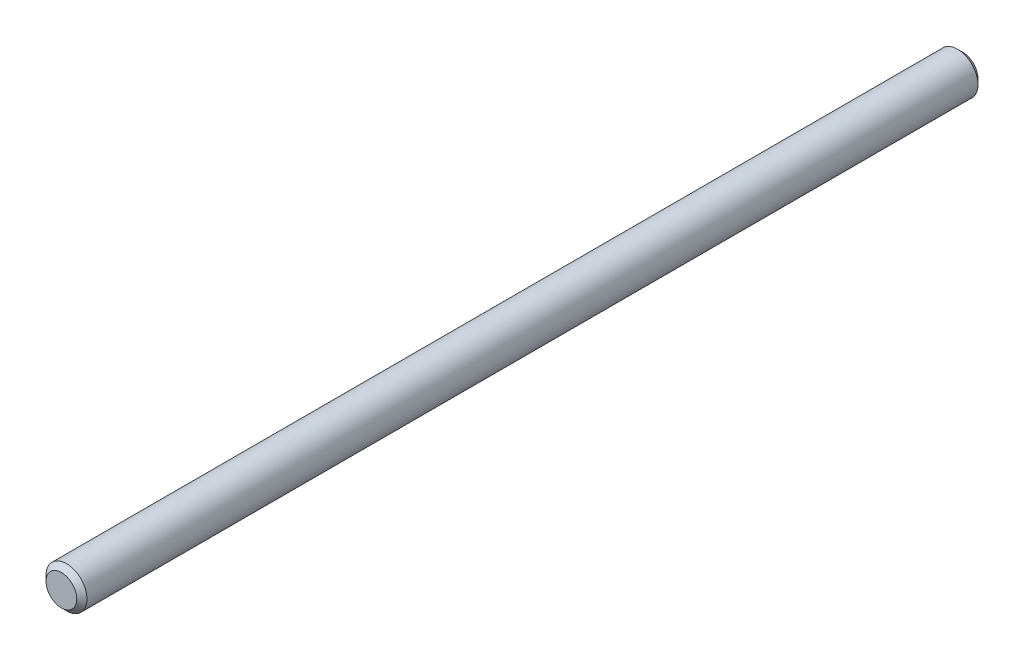
ISO-10303-21;
HEADER;
FILE_DESCRIPTION(('STEP AP214'),'2;1');
FILE_NAME('part.step','',(''),(''),'','','');
FILE_SCHEMA(('AUTOMOTIVE_DESIGN { 1 0 10303 214 1 1 1 1 }'));
ENDSEC;
DATA;
#1=APPLICATION_CONTEXT('core data for automotive mechanical design processes');
#2=APPLICATION_PROTOCOL_DEFINITION('international standard','automotive_design',2000,#1);
#3=PRODUCT_CONTEXT('',#1,'mechanical');
#4=PRODUCT('Part','Part','',(#3));
#5=PRODUCT_RELATED_PRODUCT_CATEGORY('part','',(#4));
#6=PRODUCT_DEFINITION_FORMATION('','',#4);
#7=PRODUCT_DEFINITION_CONTEXT('part definition',#1,'design');
#8=PRODUCT_DEFINITION('design','',#6,#7);
#9=PRODUCT_DEFINITION_SHAPE('','',#8);
#10=(LENGTH_UNIT() NAMED_UNIT(*) SI_UNIT(.MILLI.,.METRE.));
#11=(NAMED_UNIT(*) PLANE_ANGLE_UNIT() SI_UNIT($,.RADIAN.));
#12=(NAMED_UNIT(*) SI_UNIT($,.STERADIAN.) SOLID_ANGLE_UNIT());
#13=UNCERTAINTY_MEASURE_WITH_UNIT(LENGTH_MEASURE(1.E-05),#10,'distance_accuracy_value','');
#14=(GEOMETRIC_REPRESENTATION_CONTEXT(3) GLOBAL_UNCERTAINTY_ASSIGNED_CONTEXT((#13)) GLOBAL_UNIT_ASSIGNED_CONTEXT((#10,
#11,#12)) REPRESENTATION_CONTEXT('',''));
#15=CARTESIAN_POINT('',(0.,0.,0.));
#16=DIRECTION('',(0.,0.,1.));
#17=DIRECTION('',(1.,0.,0.));
#18=AXIS2_PLACEMENT_3D('',#15,#16,#17);
#19=CARTESIAN_POINT('',(0.,0.,88.));
#20=DIRECTION('',(0.,0.,1.));
#21=DIRECTION('',(1.,0.,0.));
#22=AXIS2_PLACEMENT_3D('',#19,#20,#21);
#23=PLANE('',#22);
#24=CARTESIAN_POINT('',(0.,0.,88.0000000000791));
#25=DIRECTION('',(0.,0.,-1.));
#26=DIRECTION('',(-1.,0.,0.));
#27=AXIS2_PLACEMENT_3D('',#24,#25,#26);
#28=CIRCLE('',#27,1.49999999996453);
#29=CARTESIAN_POINT('',(-1.49999999996453,0.,88.0000000000791));
#30=VERTEX_POINT('',#29);
#31=EDGE_CURVE('E18',#30,#30,#28,.T.);
#32=ORIENTED_EDGE('',*,*,#31,.F.);
#33=EDGE_LOOP('',(#32));
#34=FACE_BOUND('',#33,.T.);
#35=ADVANCED_FACE('F15',(#34),#23,.T.);
#36=CARTESIAN_POINT('',(0.,0.,0.));
#37=DIRECTION('',(0.,0.,1.));
#38=DIRECTION('',(1.,0.,0.));
#39=AXIS2_PLACEMENT_3D('',#36,#37,#38);
#40=PLANE('',#39);
#41=CARTESIAN_POINT('',(0.,0.,0.));
#42=DIRECTION('',(0.,0.,1.));
#43=DIRECTION('',(1.,0.,0.));
#44=AXIS2_PLACEMENT_3D('',#41,#42,#43);
#45=CIRCLE('',#44,1.50000000002137);
#46=CARTESIAN_POINT('',(1.50000000002137,0.,0.));
#47=VERTEX_POINT('',#46);
#48=EDGE_CURVE('E27',#47,#47,#45,.T.);
#49=ORIENTED_EDGE('',*,*,#48,.F.);
#50=EDGE_LOOP('',(#49));
#51=FACE_BOUND('',#50,.T.);
#52=ADVANCED_FACE('F38',(#51),#40,.F.);
#53=CARTESIAN_POINT('',(0.,0.,87.5000000001478));
#54=DIRECTION('',(0.,0.,-1.));
#55=DIRECTION('',(-1.,0.,0.));
#56=AXIS2_PLACEMENT_3D('',#53,#54,#55);
#57=CONICAL_SURFACE('',#56,1.99999999989586,0.785398163397448);
#58=CARTESIAN_POINT('',(0.,0.,87.5));
#59=DIRECTION('',(0.,0.,-1.));
#60=DIRECTION('',(-1.,0.,0.));
#61=AXIS2_PLACEMENT_3D('',#58,#59,#60);
#62=CIRCLE('',#61,2.);
#63=CARTESIAN_POINT('',(-2.,0.,87.5));
#64=VERTEX_POINT('',#63);
#65=EDGE_CURVE('E22',#64,#64,#62,.T.);
#66=ORIENTED_EDGE('',*,*,#65,.F.);
#67=EDGE_LOOP('',(#66));
#68=FACE_BOUND('',#67,.T.);
#69=ORIENTED_EDGE('',*,*,#31,.T.);
#70=EDGE_LOOP('',(#69));
#71=FACE_BOUND('',#70,.T.);
#72=ADVANCED_FACE('F35',(#68,#71),#57,.T.);
#73=CARTESIAN_POINT('',(0.,0.,0.49999999987449));
#74=DIRECTION('',(0.,0.,1.));
#75=DIRECTION('',(1.,0.,0.));
#76=AXIS2_PLACEMENT_3D('',#73,#74,#75);
#77=CONICAL_SURFACE('',#76,1.99999999989586,0.785398163397448);
#78=CARTESIAN_POINT('',(0.,0.,0.499999999999987));
#79=DIRECTION('',(0.,0.,-1.));
#80=DIRECTION('',(-1.,0.,0.));
#81=AXIS2_PLACEMENT_3D('',#78,#79,#80);
#82=CIRCLE('',#81,2.);
#83=CARTESIAN_POINT('',(-2.,0.,0.499999999999987));
#84=VERTEX_POINT('',#83);
#85=EDGE_CURVE('E9',#84,#84,#82,.F.);
#86=ORIENTED_EDGE('',*,*,#85,.F.);
#87=EDGE_LOOP('',(#86));
#88=FACE_BOUND('',#87,.T.);
#89=ORIENTED_EDGE('',*,*,#48,.T.);
#90=EDGE_LOOP('',(#89));
#91=FACE_BOUND('',#90,.T.);
#92=ADVANCED_FACE('F45',(#88,#91),#77,.T.);
#93=CARTESIAN_POINT('',(0.,0.,88.));
#94=DIRECTION('',(0.,0.,-1.));
#95=DIRECTION('',(-1.,0.,0.));
#96=AXIS2_PLACEMENT_3D('',#93,#94,#95);
#97=CYLINDRICAL_SURFACE('',#96,2.);
#98=ORIENTED_EDGE('',*,*,#85,.T.);
#99=EDGE_LOOP('',(#98));
#100=FACE_BOUND('',#99,.T.);
#101=ORIENTED_EDGE('',*,*,#65,.T.);
#102=EDGE_LOOP('',(#101));
#103=FACE_BOUND('',#102,.T.);
#104=ADVANCED_FACE('F43',(#100,#103),#97,.T.);
#105=CLOSED_SHELL('',(#35,#52,#72,#92,#104));
#106=MANIFOLD_SOLID_BREP('B1',#105);
#107=ADVANCED_BREP_SHAPE_REPRESENTATION('',(#18,#106),#14);
#108=SHAPE_DEFINITION_REPRESENTATION(#9,#107);
ENDSEC;
END-ISO-10303-21;
